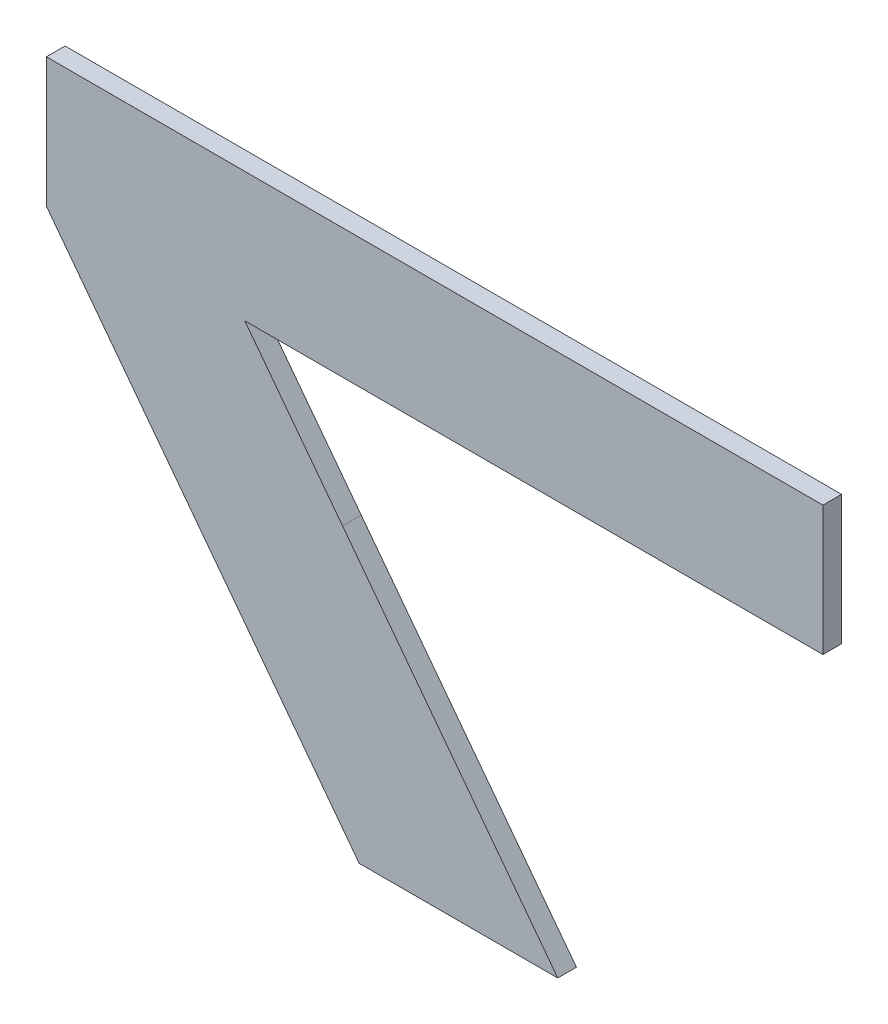
ISO-10303-21;
HEADER;
FILE_DESCRIPTION(('STEP AP214'),'2;1');
FILE_NAME('part.step','',(''),(''),'','','');
FILE_SCHEMA(('AUTOMOTIVE_DESIGN { 1 0 10303 214 1 1 1 1 }'));
ENDSEC;
DATA;
#1=APPLICATION_CONTEXT('core data for automotive mechanical design processes');
#2=APPLICATION_PROTOCOL_DEFINITION('international standard','automotive_design',2000,#1);
#3=PRODUCT_CONTEXT('',#1,'mechanical');
#4=PRODUCT('Part','Part','',(#3));
#5=PRODUCT_RELATED_PRODUCT_CATEGORY('part','',(#4));
#6=PRODUCT_DEFINITION_FORMATION('','',#4);
#7=PRODUCT_DEFINITION_CONTEXT('part definition',#1,'design');
#8=PRODUCT_DEFINITION('design','',#6,#7);
#9=PRODUCT_DEFINITION_SHAPE('','',#8);
#10=(LENGTH_UNIT() NAMED_UNIT(*) SI_UNIT(.MILLI.,.METRE.));
#11=(NAMED_UNIT(*) PLANE_ANGLE_UNIT() SI_UNIT($,.RADIAN.));
#12=(NAMED_UNIT(*) SI_UNIT($,.STERADIAN.) SOLID_ANGLE_UNIT());
#13=UNCERTAINTY_MEASURE_WITH_UNIT(LENGTH_MEASURE(1.E-05),#10,'distance_accuracy_value','');
#14=(GEOMETRIC_REPRESENTATION_CONTEXT(3) GLOBAL_UNCERTAINTY_ASSIGNED_CONTEXT((#13)) GLOBAL_UNIT_ASSIGNED_CONTEXT((#10,
#11,#12)) REPRESENTATION_CONTEXT('',''));
#15=CARTESIAN_POINT('',(0.,0.,0.));
#16=DIRECTION('',(0.,0.,1.));
#17=DIRECTION('',(1.,0.,0.));
#18=AXIS2_PLACEMENT_3D('',#15,#16,#17);
#19=CARTESIAN_POINT('',(11.9230769230769,-11.3942307692308,0.5));
#20=DIRECTION('',(-0.796952335800278,-0.604042195928795,0.));
#21=DIRECTION('',(0.604042195928795,-0.796952335800278,0.));
#22=AXIS2_PLACEMENT_3D('',#19,#20,#21);
#23=PLANE('',#22);
#24=DIRECTION('',(-0.604042195928795,0.796952335800278,0.));
#25=VECTOR('',#24,1.);
#26=CARTESIAN_POINT('',(11.9230769230769,-11.3942307692308,0.5));
#27=LINE('',#26,#25);
#28=CARTESIAN_POINT('',(2.90796152660169,0.5,0.5));
#29=VERTEX_POINT('',#28);
#30=CARTESIAN_POINT('',(-2.84855769230768,8.09495192307692,0.5));
#31=VERTEX_POINT('',#30);
#32=EDGE_CURVE('E120',#29,#31,#27,.T.);
#33=ORIENTED_EDGE('',*,*,#32,.F.);
#34=DIRECTION('',(0.,0.,-1.));
#35=VECTOR('',#34,1.);
#36=CARTESIAN_POINT('',(2.90796152660169,0.5,0.5));
#37=LINE('',#36,#35);
#38=CARTESIAN_POINT('',(2.90796152660169,0.5,0.));
#39=VERTEX_POINT('',#38);
#40=EDGE_CURVE('E53',#29,#39,#37,.T.);
#41=ORIENTED_EDGE('',*,*,#40,.T.);
#42=DIRECTION('',(-0.604042195928795,0.796952335800278,0.));
#43=VECTOR('',#42,1.);
#44=CARTESIAN_POINT('',(11.9230769230769,-11.3942307692308,0.));
#45=LINE('',#44,#43);
#46=CARTESIAN_POINT('',(-2.84855769230768,8.09495192307692,0.));
#47=VERTEX_POINT('',#46);
#48=EDGE_CURVE('E115',#39,#47,#45,.T.);
#49=ORIENTED_EDGE('',*,*,#48,.T.);
#50=DIRECTION('',(0.,0.,-1.));
#51=VECTOR('',#50,1.);
#52=CARTESIAN_POINT('',(-2.84855769230768,8.09495192307692,0.5));
#53=LINE('',#52,#51);
#54=EDGE_CURVE('E171',#31,#47,#53,.T.);
#55=ORIENTED_EDGE('',*,*,#54,.F.);
#56=EDGE_LOOP('',(#33,#41,#49,#55));
#57=FACE_BOUND('',#56,.T.);
#58=ADVANCED_FACE('F39',(#57),#23,.F.);
#59=CARTESIAN_POINT('',(-10.7692307692308,11.5384615384615,0.5));
#60=DIRECTION('',(0.796973212355203,0.604014651137063,0.));
#61=DIRECTION('',(-0.604014651137063,0.796973212355203,0.));
#62=AXIS2_PLACEMENT_3D('',#59,#60,#61);
#63=PLANE('',#62);
#64=DIRECTION('',(0.604014651137064,-0.796973212355203,0.));
#65=VECTOR('',#64,1.);
#66=CARTESIAN_POINT('',(-10.7692307692308,11.5384615384615,0.));
#67=LINE('',#66,#65);
#68=CARTESIAN_POINT('',(-10.7692307692308,11.5384615384615,0.));
#69=VERTEX_POINT('',#68);
#70=CARTESIAN_POINT('',(-2.40333792379827,0.499999999999999,0.));
#71=VERTEX_POINT('',#70);
#72=EDGE_CURVE('E103',#69,#71,#67,.T.);
#73=ORIENTED_EDGE('',*,*,#72,.T.);
#74=DIRECTION('',(0.,0.,1.));
#75=VECTOR('',#74,1.);
#76=CARTESIAN_POINT('',(-2.40333792379827,0.5,0.5));
#77=LINE('',#76,#75);
#78=CARTESIAN_POINT('',(-2.40333792379827,0.5,0.5));
#79=VERTEX_POINT('',#78);
#80=EDGE_CURVE('E100',#71,#79,#77,.T.);
#81=ORIENTED_EDGE('',*,*,#80,.T.);
#82=DIRECTION('',(0.604014651137064,-0.796973212355203,0.));
#83=VECTOR('',#82,1.);
#84=CARTESIAN_POINT('',(-10.7692307692308,11.5384615384615,0.5));
#85=LINE('',#84,#83);
#86=CARTESIAN_POINT('',(-10.7692307692308,11.5384615384615,0.5));
#87=VERTEX_POINT('',#86);
#88=EDGE_CURVE('E123',#87,#79,#85,.T.);
#89=ORIENTED_EDGE('',*,*,#88,.F.);
#90=DIRECTION('',(0.,0.,-1.));
#91=VECTOR('',#90,1.);
#92=CARTESIAN_POINT('',(-10.7692307692308,11.5384615384615,0.5));
#93=LINE('',#92,#91);
#94=EDGE_CURVE('E101',#87,#69,#93,.T.);
#95=ORIENTED_EDGE('',*,*,#94,.T.);
#96=EDGE_LOOP('',(#73,#81,#89,#95));
#97=FACE_BOUND('',#96,.T.);
#98=ADVANCED_FACE('F114',(#97),#63,.F.);
#99=CARTESIAN_POINT('',(-4.15519373240783,9.81705667858863,0.5));
#100=DIRECTION('',(0.,0.,1.));
#101=DIRECTION('',(1.,0.,0.));
#102=AXIS2_PLACEMENT_3D('',#99,#100,#101);
#103=PLANE('',#102);
#104=DIRECTION('',(-1.,0.,0.));
#105=VECTOR('',#104,1.);
#106=CARTESIAN_POINT('',(-4.15519373240783,0.5,0.5));
#107=LINE('',#106,#105);
#108=EDGE_CURVE('E48',#29,#79,#107,.T.);
#109=ORIENTED_EDGE('',*,*,#108,.F.);
#110=ORIENTED_EDGE('',*,*,#32,.T.);
#111=CARTESIAN_POINT('',(-2.84855769230768,8.09495192307692,0.5));
#112=CARTESIAN_POINT('',(-3.09958503441702,8.42300192853996,0.5));
#113=CARTESIAN_POINT('',(-3.58093818742061,9.05204856204853,0.5));
#114=CARTESIAN_POINT('',(-4.26080632252778,9.96098468798088,0.5));
#115=CARTESIAN_POINT('',(-4.88930244099649,10.7745969316363,0.5));
#116=CARTESIAN_POINT('',(-5.27897349774461,11.2936695389975,0.5));
#117=CARTESIAN_POINT('',(-5.46274038461537,11.5384615384615,0.5));
#118=B_SPLINE_CURVE_WITH_KNOTS('',3,(#111,#112,#113,#114,#115,#116,#117),.UNSPECIFIED.,.F.,.F.,
(4,1,1,1,4),(0.,0.286630334276487,0.549623056959132,0.78760452615682,1.),.UNSPECIFIED.);
#119=CARTESIAN_POINT('',(-5.46274038461537,11.5384615384615,0.5));
#120=VERTEX_POINT('',#119);
#121=EDGE_CURVE('E118',#31,#120,#118,.T.);
#122=ORIENTED_EDGE('',*,*,#121,.T.);
#123=DIRECTION('',(1.,0.,0.));
#124=VECTOR('',#123,1.);
#125=CARTESIAN_POINT('',(-5.46274038461537,11.5384615384615,0.5));
#126=LINE('',#125,#124);
#127=CARTESIAN_POINT('',(10.,11.5384615384615,0.5));
#128=VERTEX_POINT('',#127);
#129=EDGE_CURVE('E135',#120,#128,#126,.T.);
#130=ORIENTED_EDGE('',*,*,#129,.T.);
#131=DIRECTION('',(0.,1.,0.));
#132=VECTOR('',#131,1.);
#133=CARTESIAN_POINT('',(10.,11.5384615384615,0.5));
#134=LINE('',#133,#132);
#135=CARTESIAN_POINT('',(10.,15.,0.5));
#136=VERTEX_POINT('',#135);
#137=EDGE_CURVE('E201',#128,#136,#134,.T.);
#138=ORIENTED_EDGE('',*,*,#137,.T.);
#139=DIRECTION('',(-1.,0.,0.));
#140=VECTOR('',#139,1.);
#141=CARTESIAN_POINT('',(10.,15.,0.5));
#142=LINE('',#141,#140);
#143=CARTESIAN_POINT('',(-10.7692307692308,15.,0.5));
#144=VERTEX_POINT('',#143);
#145=EDGE_CURVE('E178',#136,#144,#142,.T.);
#146=ORIENTED_EDGE('',*,*,#145,.T.);
#147=DIRECTION('',(0.,-1.,0.));
#148=VECTOR('',#147,1.);
#149=CARTESIAN_POINT('',(-10.7692307692308,15.,0.5));
#150=LINE('',#149,#148);
#151=EDGE_CURVE('E125',#144,#87,#150,.T.);
#152=ORIENTED_EDGE('',*,*,#151,.T.);
#153=ORIENTED_EDGE('',*,*,#88,.T.);
#154=EDGE_LOOP('',(#109,#110,#122,#130,#138,#146,#152,#153));
#155=FACE_BOUND('',#154,.T.);
#156=ADVANCED_FACE('F158',(#155),#103,.T.);
#157=CARTESIAN_POINT('',(-4.15519373240783,9.81705667858863,0.));
#158=DIRECTION('',(0.,0.,1.));
#159=DIRECTION('',(1.,0.,0.));
#160=AXIS2_PLACEMENT_3D('',#157,#158,#159);
#161=PLANE('',#160);
#162=DIRECTION('',(1.,0.,0.));
#163=VECTOR('',#162,1.);
#164=CARTESIAN_POINT('',(-17.,0.5,0.));
#165=LINE('',#164,#163);
#166=EDGE_CURVE('E11',#71,#39,#165,.T.);
#167=ORIENTED_EDGE('',*,*,#166,.F.);
#168=ORIENTED_EDGE('',*,*,#72,.F.);
#169=DIRECTION('',(0.,-1.,0.));
#170=VECTOR('',#169,1.);
#171=CARTESIAN_POINT('',(-10.7692307692308,15.,0.));
#172=LINE('',#171,#170);
#173=CARTESIAN_POINT('',(-10.7692307692308,15.,0.));
#174=VERTEX_POINT('',#173);
#175=EDGE_CURVE('E185',#174,#69,#172,.T.);
#176=ORIENTED_EDGE('',*,*,#175,.F.);
#177=DIRECTION('',(-1.,0.,0.));
#178=VECTOR('',#177,1.);
#179=CARTESIAN_POINT('',(10.,15.,0.));
#180=LINE('',#179,#178);
#181=CARTESIAN_POINT('',(10.,15.,0.));
#182=VERTEX_POINT('',#181);
#183=EDGE_CURVE('E188',#182,#174,#180,.T.);
#184=ORIENTED_EDGE('',*,*,#183,.F.);
#185=DIRECTION('',(0.,1.,0.));
#186=VECTOR('',#185,1.);
#187=CARTESIAN_POINT('',(10.,11.5384615384615,0.));
#188=LINE('',#187,#186);
#189=CARTESIAN_POINT('',(10.,11.5384615384615,0.));
#190=VERTEX_POINT('',#189);
#191=EDGE_CURVE('E195',#190,#182,#188,.T.);
#192=ORIENTED_EDGE('',*,*,#191,.F.);
#193=DIRECTION('',(1.,0.,0.));
#194=VECTOR('',#193,1.);
#195=CARTESIAN_POINT('',(-5.46274038461537,11.5384615384615,0.));
#196=LINE('',#195,#194);
#197=CARTESIAN_POINT('',(-5.46274038461537,11.5384615384615,0.));
#198=VERTEX_POINT('',#197);
#199=EDGE_CURVE('E193',#198,#190,#196,.T.);
#200=ORIENTED_EDGE('',*,*,#199,.F.);
#201=CARTESIAN_POINT('',(-2.84855769230768,8.09495192307692,0.));
#202=CARTESIAN_POINT('',(-3.09958503441702,8.42300192853996,0.));
#203=CARTESIAN_POINT('',(-3.58093818742061,9.05204856204853,0.));
#204=CARTESIAN_POINT('',(-4.26080632252778,9.96098468798088,0.));
#205=CARTESIAN_POINT('',(-4.88930244099649,10.7745969316363,0.));
#206=CARTESIAN_POINT('',(-5.27897349774461,11.2936695389975,0.));
#207=CARTESIAN_POINT('',(-5.46274038461537,11.5384615384615,0.));
#208=B_SPLINE_CURVE_WITH_KNOTS('',3,(#201,#202,#203,#204,#205,#206,#207),.UNSPECIFIED.,.F.,.F.,
(4,1,1,1,4),(0.,0.286630334276487,0.549623056959132,0.78760452615682,1.),.UNSPECIFIED.);
#209=EDGE_CURVE('E121',#47,#198,#208,.T.);
#210=ORIENTED_EDGE('',*,*,#209,.F.);
#211=ORIENTED_EDGE('',*,*,#48,.F.);
#212=EDGE_LOOP('',(#167,#168,#176,#184,#192,#200,#210,#211));
#213=FACE_BOUND('',#212,.T.);
#214=ADVANCED_FACE('F41',(#213),#161,.F.);
#215=DIRECTION('',(0.,0.,-1.));
#216=VECTOR('',#215,1.);
#217=SURFACE_OF_LINEAR_EXTRUSION('',#118,#216);
#218=ORIENTED_EDGE('',*,*,#209,.T.);
#219=DIRECTION('',(0.,0.,-1.));
#220=VECTOR('',#219,1.);
#221=CARTESIAN_POINT('',(-5.46274038461537,11.5384615384615,0.5));
#222=LINE('',#221,#220);
#223=EDGE_CURVE('E191',#120,#198,#222,.T.);
#224=ORIENTED_EDGE('',*,*,#223,.F.);
#225=ORIENTED_EDGE('',*,*,#121,.F.);
#226=ORIENTED_EDGE('',*,*,#54,.T.);
#227=EDGE_LOOP('',(#218,#224,#225,#226));
#228=FACE_BOUND('',#227,.T.);
#229=ADVANCED_FACE('F138',(#228),#217,.F.);
#230=CARTESIAN_POINT('',(-5.46274038461537,11.5384615384615,0.5));
#231=DIRECTION('',(0.,1.,0.));
#232=DIRECTION('',(0.,0.,1.));
#233=AXIS2_PLACEMENT_3D('',#230,#231,#232);
#234=PLANE('',#233);
#235=ORIENTED_EDGE('',*,*,#199,.T.);
#236=DIRECTION('',(0.,0.,-1.));
#237=VECTOR('',#236,1.);
#238=CARTESIAN_POINT('',(10.,11.5384615384615,0.5));
#239=LINE('',#238,#237);
#240=EDGE_CURVE('E192',#128,#190,#239,.T.);
#241=ORIENTED_EDGE('',*,*,#240,.F.);
#242=ORIENTED_EDGE('',*,*,#129,.F.);
#243=ORIENTED_EDGE('',*,*,#223,.T.);
#244=EDGE_LOOP('',(#235,#241,#242,#243));
#245=FACE_BOUND('',#244,.T.);
#246=ADVANCED_FACE('F141',(#245),#234,.F.);
#247=CARTESIAN_POINT('',(10.,11.5384615384615,0.5));
#248=DIRECTION('',(-1.,0.,0.));
#249=DIRECTION('',(0.,0.,1.));
#250=AXIS2_PLACEMENT_3D('',#247,#248,#249);
#251=PLANE('',#250);
#252=ORIENTED_EDGE('',*,*,#191,.T.);
#253=DIRECTION('',(0.,0.,-1.));
#254=VECTOR('',#253,1.);
#255=CARTESIAN_POINT('',(10.,15.,0.5));
#256=LINE('',#255,#254);
#257=EDGE_CURVE('E187',#136,#182,#256,.T.);
#258=ORIENTED_EDGE('',*,*,#257,.F.);
#259=ORIENTED_EDGE('',*,*,#137,.F.);
#260=ORIENTED_EDGE('',*,*,#240,.T.);
#261=EDGE_LOOP('',(#252,#258,#259,#260));
#262=FACE_BOUND('',#261,.T.);
#263=ADVANCED_FACE('F144',(#262),#251,.F.);
#264=CARTESIAN_POINT('',(10.,15.,0.5));
#265=DIRECTION('',(0.,-1.,0.));
#266=DIRECTION('',(0.,0.,-1.));
#267=AXIS2_PLACEMENT_3D('',#264,#265,#266);
#268=PLANE('',#267);
#269=ORIENTED_EDGE('',*,*,#183,.T.);
#270=DIRECTION('',(0.,0.,-1.));
#271=VECTOR('',#270,1.);
#272=CARTESIAN_POINT('',(-10.7692307692308,15.,0.5));
#273=LINE('',#272,#271);
#274=EDGE_CURVE('E124',#144,#174,#273,.T.);
#275=ORIENTED_EDGE('',*,*,#274,.F.);
#276=ORIENTED_EDGE('',*,*,#145,.F.);
#277=ORIENTED_EDGE('',*,*,#257,.T.);
#278=EDGE_LOOP('',(#269,#275,#276,#277));
#279=FACE_BOUND('',#278,.T.);
#280=ADVANCED_FACE('F146',(#279),#268,.F.);
#281=CARTESIAN_POINT('',(-10.7692307692308,15.,0.5));
#282=DIRECTION('',(1.,0.,0.));
#283=DIRECTION('',(0.,0.,-1.));
#284=AXIS2_PLACEMENT_3D('',#281,#282,#283);
#285=PLANE('',#284);
#286=ORIENTED_EDGE('',*,*,#175,.T.);
#287=ORIENTED_EDGE('',*,*,#94,.F.);
#288=ORIENTED_EDGE('',*,*,#151,.F.);
#289=ORIENTED_EDGE('',*,*,#274,.T.);
#290=EDGE_LOOP('',(#286,#287,#288,#289));
#291=FACE_BOUND('',#290,.T.);
#292=ADVANCED_FACE('F155',(#291),#285,.F.);
#293=CARTESIAN_POINT('',(-17.,0.5,1.));
#294=DIRECTION('',(0.,1.,0.));
#295=DIRECTION('',(0.,0.,1.));
#296=AXIS2_PLACEMENT_3D('',#293,#294,#295);
#297=PLANE('',#296);
#298=ORIENTED_EDGE('',*,*,#108,.T.);
#299=ORIENTED_EDGE('',*,*,#80,.F.);
#300=ORIENTED_EDGE('',*,*,#166,.T.);
#301=ORIENTED_EDGE('',*,*,#40,.F.);
#302=EDGE_LOOP('',(#298,#299,#300,#301));
#303=FACE_BOUND('',#302,.T.);
#304=ADVANCED_FACE('F98',(#303),#297,.F.);
#305=CLOSED_SHELL('',(#58,#98,#156,#214,#229,#246,#263,#280,#292,#304));
#306=MANIFOLD_SOLID_BREP('B2',#305);
#307=ADVANCED_BREP_SHAPE_REPRESENTATION('',(#18,#306),#14);
#308=SHAPE_DEFINITION_REPRESENTATION(#9,#307);
ENDSEC;
END-ISO-10303-21;
